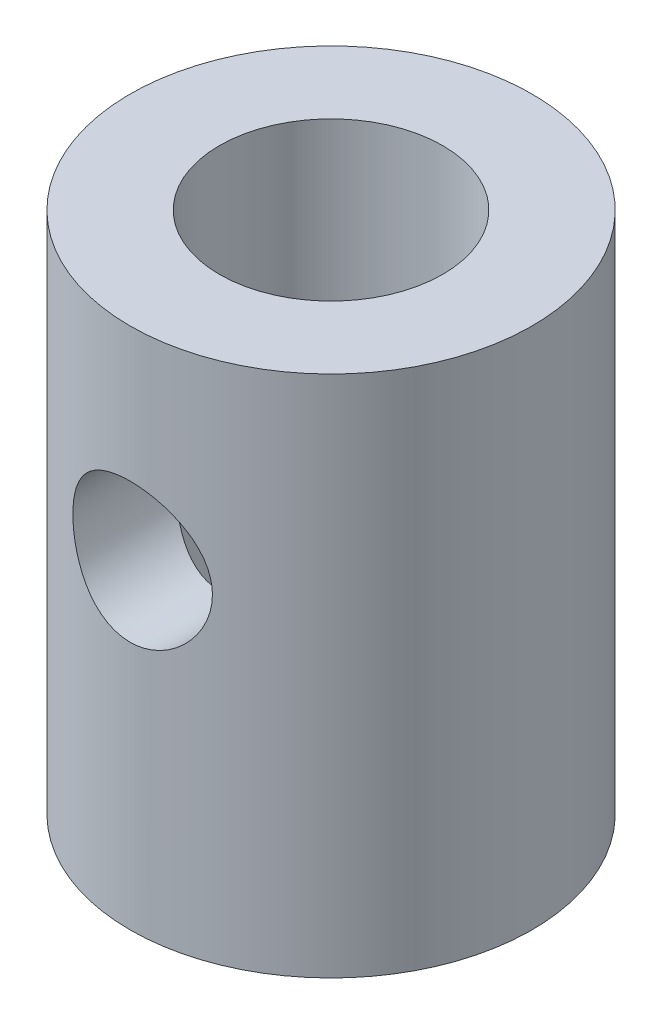
ISO-10303-21;
HEADER;
FILE_DESCRIPTION(('STEP AP214'),'2;1');
FILE_NAME('part.step','',(''),(''),'','','');
FILE_SCHEMA(('AUTOMOTIVE_DESIGN { 1 0 10303 214 1 1 1 1 }'));
ENDSEC;
DATA;
#1=APPLICATION_CONTEXT('core data for automotive mechanical design processes');
#2=APPLICATION_PROTOCOL_DEFINITION('international standard','automotive_design',2000,#1);
#3=PRODUCT_CONTEXT('',#1,'mechanical');
#4=PRODUCT('Part','Part','',(#3));
#5=PRODUCT_RELATED_PRODUCT_CATEGORY('part','',(#4));
#6=PRODUCT_DEFINITION_FORMATION('','',#4);
#7=PRODUCT_DEFINITION_CONTEXT('part definition',#1,'design');
#8=PRODUCT_DEFINITION('design','',#6,#7);
#9=PRODUCT_DEFINITION_SHAPE('','',#8);
#10=(LENGTH_UNIT() NAMED_UNIT(*) SI_UNIT(.MILLI.,.METRE.));
#11=(NAMED_UNIT(*) PLANE_ANGLE_UNIT() SI_UNIT($,.RADIAN.));
#12=(NAMED_UNIT(*) SI_UNIT($,.STERADIAN.) SOLID_ANGLE_UNIT());
#13=UNCERTAINTY_MEASURE_WITH_UNIT(LENGTH_MEASURE(1.E-05),#10,'distance_accuracy_value','');
#14=(GEOMETRIC_REPRESENTATION_CONTEXT(3) GLOBAL_UNCERTAINTY_ASSIGNED_CONTEXT((#13)) GLOBAL_UNIT_ASSIGNED_CONTEXT((#10,
#11,#12)) REPRESENTATION_CONTEXT('',''));
#15=CARTESIAN_POINT('',(0.,0.,0.));
#16=DIRECTION('',(0.,0.,1.));
#17=DIRECTION('',(1.,0.,0.));
#18=AXIS2_PLACEMENT_3D('',#15,#16,#17);
#19=CARTESIAN_POINT('',(0.,20.828,0.));
#20=DIRECTION('',(0.,1.,0.));
#21=DIRECTION('',(0.,0.,1.));
#22=AXIS2_PLACEMENT_3D('',#19,#20,#21);
#23=PLANE('',#22);
#24=CARTESIAN_POINT('',(0.,20.828,0.));
#25=DIRECTION('',(0.,1.,0.));
#26=DIRECTION('',(0.,0.,1.));
#27=AXIS2_PLACEMENT_3D('',#24,#25,#26);
#28=CIRCLE('',#27,8.001);
#29=CARTESIAN_POINT('',(0.,20.828,8.001));
#30=VERTEX_POINT('',#29);
#31=EDGE_CURVE('E12',#30,#30,#28,.T.);
#32=ORIENTED_EDGE('',*,*,#31,.T.);
#33=EDGE_LOOP('',(#32));
#34=FACE_BOUND('',#33,.T.);
#35=CARTESIAN_POINT('',(0.,20.828,0.));
#36=DIRECTION('',(0.,1.,0.));
#37=DIRECTION('',(0.,0.,1.));
#38=AXIS2_PLACEMENT_3D('',#35,#36,#37);
#39=CIRCLE('',#38,4.445);
#40=CARTESIAN_POINT('',(0.,20.828,4.445));
#41=VERTEX_POINT('',#40);
#42=EDGE_CURVE('E63',#41,#41,#39,.T.);
#43=ORIENTED_EDGE('',*,*,#42,.F.);
#44=EDGE_LOOP('',(#43));
#45=FACE_BOUND('',#44,.T.);
#46=ADVANCED_FACE('F45',(#34,#45),#23,.T.);
#47=CARTESIAN_POINT('',(0.,0.,0.));
#48=DIRECTION('',(0.,1.,0.));
#49=DIRECTION('',(0.,0.,1.));
#50=AXIS2_PLACEMENT_3D('',#47,#48,#49);
#51=PLANE('',#50);
#52=CARTESIAN_POINT('',(0.,0.,0.));
#53=DIRECTION('',(0.,1.,0.));
#54=DIRECTION('',(0.,0.,1.));
#55=AXIS2_PLACEMENT_3D('',#52,#53,#54);
#56=CIRCLE('',#55,8.001);
#57=CARTESIAN_POINT('',(0.,0.,8.001));
#58=VERTEX_POINT('',#57);
#59=EDGE_CURVE('E58',#58,#58,#56,.T.);
#60=ORIENTED_EDGE('',*,*,#59,.F.);
#61=EDGE_LOOP('',(#60));
#62=FACE_BOUND('',#61,.T.);
#63=CARTESIAN_POINT('',(0.,0.,0.));
#64=DIRECTION('',(0.,1.,0.));
#65=DIRECTION('',(0.,0.,1.));
#66=AXIS2_PLACEMENT_3D('',#63,#64,#65);
#67=CIRCLE('',#66,4.445);
#68=CARTESIAN_POINT('',(0.,0.,4.445));
#69=VERTEX_POINT('',#68);
#70=EDGE_CURVE('E65',#69,#69,#67,.T.);
#71=ORIENTED_EDGE('',*,*,#70,.T.);
#72=EDGE_LOOP('',(#71));
#73=FACE_BOUND('',#72,.T.);
#74=ADVANCED_FACE('F85',(#62,#73),#51,.F.);
#75=CARTESIAN_POINT('',(0.,20.828,0.));
#76=DIRECTION('',(0.,-1.,0.));
#77=DIRECTION('',(0.,0.,-1.));
#78=AXIS2_PLACEMENT_3D('',#75,#76,#77);
#79=CYLINDRICAL_SURFACE('',#78,8.001);
#80=CARTESIAN_POINT('',(2.77876,12.7,7.50296567114631));
#81=CARTESIAN_POINT('',(2.77876212863539,12.549059022471,7.50296389657498));
#82=CARTESIAN_POINT('',(2.76642003558003,12.3981328603388,7.5075702070208));
#83=CARTESIAN_POINT('',(2.7175626943319,12.1007778159867,7.52539149104492));
#84=CARTESIAN_POINT('',(2.6810451243575,11.9543493671349,7.53860729146559));
#85=CARTESIAN_POINT('',(2.5852951565136,11.6703510400628,7.57197390736818));
#86=CARTESIAN_POINT('',(2.52611039842604,11.5327632847795,7.59211016902121));
#87=CARTESIAN_POINT('',(2.38687097517846,11.2694217526699,7.63702697064032));
#88=CARTESIAN_POINT('',(2.30681111478616,11.1436709323454,7.66180866629354));
#89=CARTESIAN_POINT('',(2.12444775978158,10.9022261958283,7.71440543553159));
#90=CARTESIAN_POINT('',(2.0214045858259,10.7871082842002,7.74230069893931));
#91=CARTESIAN_POINT('',(1.79757523478949,10.5753898047312,7.79730666818172));
#92=CARTESIAN_POINT('',(1.67678593195421,10.4787925059835,7.82441723479302));
#93=CARTESIAN_POINT('',(1.41662934979774,10.3041923040121,7.87573557459727));
#94=CARTESIAN_POINT('',(1.27682954120934,10.2268002131398,7.89983815255547));
#95=CARTESIAN_POINT('',(0.985213131659621,10.0968633610155,7.94147388199872));
#96=CARTESIAN_POINT('',(0.833400080918614,10.0443112906793,7.95900896562897));
#97=CARTESIAN_POINT('',(0.528111330978504,9.96752098135245,7.98496560995782));
#98=CARTESIAN_POINT('',(0.374911711312878,9.94229442106042,7.9937044143121));
#99=CARTESIAN_POINT('',(0.0662212435110383,9.91772089710158,8.00221399416071));
#100=CARTESIAN_POINT('',(-0.0892689524623575,9.91836670427311,8.00198727476892));
#101=CARTESIAN_POINT('',(-0.391102956684875,9.94490922174468,7.99280210530326));
#102=CARTESIAN_POINT('',(-0.537554507985823,9.96973083051991,7.98421543014063));
#103=CARTESIAN_POINT('',(-0.824066996356055,10.0421326242364,7.95974865922028));
#104=CARTESIAN_POINT('',(-0.964127491195955,10.0897143814591,7.94386805959797));
#105=CARTESIAN_POINT('',(-1.23614284267697,10.2068707574686,7.90614198557191));
#106=CARTESIAN_POINT('',(-1.36796057926843,10.2767373750483,7.88421787265311));
#107=CARTESIAN_POINT('',(-1.61830707602438,10.4362343500376,7.83666662876341));
#108=CARTESIAN_POINT('',(-1.73683191309842,10.5258705189381,7.81103840969232));
#109=CARTESIAN_POINT('',(-1.96360692433919,10.7277048554603,7.75722388488318));
#110=CARTESIAN_POINT('',(-2.07102858533127,10.8408182700055,7.72897376698897));
#111=CARTESIAN_POINT('',(-2.26566084059581,11.0836740872239,7.67417944372543));
#112=CARTESIAN_POINT('',(-2.35286774012803,11.2134195230849,7.64763555085001));
#113=CARTESIAN_POINT('',(-2.50587740013897,11.4886867522508,7.5988919973985));
#114=CARTESIAN_POINT('',(-2.57129988370729,11.6344351226484,7.57677196712419));
#115=CARTESIAN_POINT('',(-2.67638092625534,11.9358450377868,7.5402995112186));
#116=CARTESIAN_POINT('',(-2.71605140202881,12.0915019606548,7.52594349328888));
#117=CARTESIAN_POINT('',(-2.76675213914958,12.4002282900116,7.50744836056379));
#118=CARTESIAN_POINT('',(-2.77907766052208,12.5530572869401,7.50284766415531));
#119=CARTESIAN_POINT('',(-2.77843003738575,12.8586364020602,7.5030882341987));
#120=CARTESIAN_POINT('',(-2.7654620074162,13.0113865299525,7.5079275918033));
#121=CARTESIAN_POINT('',(-2.71576306299798,13.3063461200688,7.52603991520172));
#122=CARTESIAN_POINT('',(-2.67996372211331,13.4487351067094,7.53898190993083));
#123=CARTESIAN_POINT('',(-2.58675355184134,13.7254457494719,7.57146789067085));
#124=CARTESIAN_POINT('',(-2.52933868983367,13.8597658948347,7.59101310851799));
#125=CARTESIAN_POINT('',(-2.3923339418058,14.1215499123709,7.6353175995827));
#126=CARTESIAN_POINT('',(-2.31206171669666,14.2486299680255,7.66023044157966));
#127=CARTESIAN_POINT('',(-2.13237838636147,14.4879821954156,7.71217848356268));
#128=CARTESIAN_POINT('',(-2.03296118205675,14.6002496289875,7.73921435826037));
#129=CARTESIAN_POINT('',(-1.81156710613403,14.8129401874223,7.79409302451528));
#130=CARTESIAN_POINT('',(-1.68867456398179,14.9124216432991,7.82190276357038));
#131=CARTESIAN_POINT('',(-1.42725355533765,15.0894280398298,7.87379715575659));
#132=CARTESIAN_POINT('',(-1.28872548756484,15.1669535402022,7.897881903841));
#133=CARTESIAN_POINT('',(-1.00049672840704,15.2971842122062,7.9395252909902));
#134=CARTESIAN_POINT('',(-0.850866093016549,15.3500318462177,7.95712126176772));
#135=CARTESIAN_POINT('',(-0.544102332625241,15.4295677355479,7.98395985371242));
#136=CARTESIAN_POINT('',(-0.386972201169217,15.4562663385898,7.99320577905578));
#137=CARTESIAN_POINT('',(-0.0782478360859416,15.4817534151245,8.00203216701422));
#138=CARTESIAN_POINT('',(0.0732230133873225,15.4818886738575,8.00207903022128));
#139=CARTESIAN_POINT('',(0.37392927634761,15.457613413975,7.99367224413965));
#140=CARTESIAN_POINT('',(0.523164896733083,15.4332051815959,7.98521938660355));
#141=CARTESIAN_POINT('',(0.812400419535031,15.3614496817474,7.96094866761162));
#142=CARTESIAN_POINT('',(0.952519983371858,15.3145343486015,7.94526969682297));
#143=CARTESIAN_POINT('',(1.22294079148731,15.1995050501196,7.90816445566002));
#144=CARTESIAN_POINT('',(1.35324021135037,15.1313871577091,7.88673712069251));
#145=CARTESIAN_POINT('',(1.60584523756447,14.9728528676057,7.83928723930165));
#146=CARTESIAN_POINT('',(1.72764411194743,14.8816734463466,7.81311858920086));
#147=CARTESIAN_POINT('',(1.95464569894471,14.6808702840873,7.75944528979499));
#148=CARTESIAN_POINT('',(2.05984286992704,14.5712404094713,7.73194019837719));
#149=CARTESIAN_POINT('',(2.25532594799463,14.3309573726194,7.67725647616264));
#150=CARTESIAN_POINT('',(2.34476435876245,14.19959724141,7.65014406997125));
#151=CARTESIAN_POINT('',(2.50026158652251,13.922856090322,7.60074861161155));
#152=CARTESIAN_POINT('',(2.56632395578108,13.7774772050353,7.57846482587683));
#153=CARTESIAN_POINT('',(2.67189332860254,13.4791637701792,7.54188846606034));
#154=CARTESIAN_POINT('',(2.71182633228712,13.3263964292559,7.52746837082996));
#155=CARTESIAN_POINT('',(2.7652528640181,13.0157458355809,7.5080099206605));
#156=CARTESIAN_POINT('',(2.77875777372164,12.8578648149056,7.50296752711929));
#157=CARTESIAN_POINT('',(2.77876,12.7,7.50296567114631));
#158=B_SPLINE_CURVE_WITH_KNOTS('',3,(#80,#81,#82,#83,#84,#85,#86,#87,#88,#89,#90,#91,#92,#93,
#94,#95,#96,#97,#98,#99,#100,#101,#102,#103,#104,#105,#106,#107,#108,#109,#110,#111,#112,#113,
#114,#115,#116,#117,#118,#119,#120,#121,#122,#123,#124,#125,#126,#127,#128,#129,#130,#131,#132,
#133,#134,#135,#136,#137,#138,#139,#140,#141,#142,#143,#144,#145,#146,#147,#148,#149,#150,#151,
#152,#153,#154,#155,#156,#157),.UNSPECIFIED.,.T.,.F.,(4,2,2,2,2,2,2,2,2,2,2,2,2,2,2,2,2,2,2,2,2,
2,2,2,2,2,2,2,2,2,2,2,2,2,2,2,2,2,4),(0.,0.452237275354751,0.904517989296236,1.35585331235259,
1.80730106760552,2.27618485464552,2.7451513288259,3.22753024247407,3.70976712941744,
4.17391115031731,4.63792548270855,5.08220505674032,5.52651532623993,5.97690464088239,
6.4274265296177,6.90084886477755,7.37435766129691,7.85574496923458,8.33690935512156,
8.79474649642942,9.25249106934883,9.69265905191249,10.1329091935264,10.5880016879361,
11.0432394032128,11.5225771284093,12.0019026328503,12.4784257553046,12.9547602312255,
13.4069375530072,13.8590727581817,14.3028584731562,14.7467264337541,15.2078266203897,
15.6690803977346,16.1503948229239,16.6316360752434,17.1048218274177,17.5778037501271),.UNSPECIFIED.);
#159=CARTESIAN_POINT('',(2.77876,12.7,7.50296567114631));
#160=VERTEX_POINT('',#159);
#161=EDGE_CURVE('E68',#160,#160,#158,.T.);
#162=ORIENTED_EDGE('',*,*,#161,.T.);
#163=EDGE_LOOP('',(#162));
#164=FACE_BOUND('',#163,.T.);
#165=ORIENTED_EDGE('',*,*,#31,.F.);
#166=EDGE_LOOP('',(#165));
#167=FACE_BOUND('',#166,.T.);
#168=ORIENTED_EDGE('',*,*,#59,.T.);
#169=EDGE_LOOP('',(#168));
#170=FACE_BOUND('',#169,.T.);
#171=ADVANCED_FACE('F47',(#164,#167,#170),#79,.T.);
#172=CARTESIAN_POINT('',(0.,20.828,0.));
#173=DIRECTION('',(0.,-1.,0.));
#174=DIRECTION('',(0.,0.,-1.));
#175=AXIS2_PLACEMENT_3D('',#172,#173,#174);
#176=CYLINDRICAL_SURFACE('',#175,4.445);
#177=CARTESIAN_POINT('',(2.77876,12.7,3.46936851060823));
#178=CARTESIAN_POINT('',(2.77875934731908,12.6309166395695,3.46936952642126));
#179=CARTESIAN_POINT('',(2.77617697453853,12.5618195414941,3.47144300397511));
#180=CARTESIAN_POINT('',(2.7659053558666,12.4242335926715,3.47963054206189));
#181=CARTESIAN_POINT('',(2.75821310658919,12.355745123658,3.48574697887806));
#182=CARTESIAN_POINT('',(2.72761055167755,12.1518117787755,3.50982671239287));
#183=CARTESIAN_POINT('',(2.69717492620982,12.0180823321502,3.53351938212347));
#184=CARTESIAN_POINT('',(2.61846097629787,11.7601767743478,3.59221679615339));
#185=CARTESIAN_POINT('',(2.57033733936576,11.6359287947105,3.62712314923444));
#186=CARTESIAN_POINT('',(2.45807045428438,11.3973976724189,3.70412606634024));
#187=CARTESIAN_POINT('',(2.39392675609931,11.2831148098264,3.74622283234769));
#188=CARTESIAN_POINT('',(2.24139959352143,11.0509295827165,3.83968322270754));
#189=CARTESIAN_POINT('',(2.15091818499494,10.9346003386169,3.89153226193118));
#190=CARTESIAN_POINT('',(1.95260107495747,10.7174457805415,3.99473617006767));
#191=CARTESIAN_POINT('',(1.84475041405381,10.6166339787791,4.04609057219778));
#192=CARTESIAN_POINT('',(1.59884622877513,10.4212597202322,4.14988111214226));
#193=CARTESIAN_POINT('',(1.45871837045145,10.3289207461489,4.20169947029498));
#194=CARTESIAN_POINT('',(1.23570842497045,10.209685934271,4.27049749886069));
#195=CARTESIAN_POINT('',(1.15921153282591,10.1731455252224,4.29194681468603));
#196=CARTESIAN_POINT('',(1.0024258524154,10.1069567819055,4.33124423288451));
#197=CARTESIAN_POINT('',(0.922139730078784,10.0773036865071,4.34909482188745));
#198=CARTESIAN_POINT('',(0.766716637839651,10.0279944837547,4.37901689523235));
#199=CARTESIAN_POINT('',(0.691880812151417,10.0076303741504,4.39149040785129));
#200=CARTESIAN_POINT('',(0.540299236139968,9.97316665099036,4.41270361164225));
#201=CARTESIAN_POINT('',(0.463554616015628,9.95906341941743,4.42144545914506));
#202=CARTESIAN_POINT('',(0.308845642266153,9.93735352929286,4.43493629990138));
#203=CARTESIAN_POINT('',(0.230882073796293,9.92974285114587,4.43968776360727));
#204=CARTESIAN_POINT('',(0.0744763649724609,9.92113246365793,4.44506638158912));
#205=CARTESIAN_POINT('',(-0.00396571921602898,9.92013199284313,4.44569401091701));
#206=CARTESIAN_POINT('',(-0.217798241054252,9.92648420264837,4.44171957075102));
#207=CARTESIAN_POINT('',(-0.352992315738801,9.94046218444269,4.43296889599955));
#208=CARTESIAN_POINT('',(-0.618580964045013,9.98760269902288,4.40378081027064));
#209=CARTESIAN_POINT('',(-0.748975174124842,10.0207666817899,4.38334251600323));
#210=CARTESIAN_POINT('',(-1.00218466487202,10.1048169625401,4.33247869258662));
#211=CARTESIAN_POINT('',(-1.12497976392599,10.1557482526514,4.30202781995137));
#212=CARTESIAN_POINT('',(-1.36036996342664,10.2734303570548,4.23349423478471));
#213=CARTESIAN_POINT('',(-1.47296273379573,10.340184772616,4.1954097851921));
#214=CARTESIAN_POINT('',(-1.69979849267399,10.4969349071812,4.10916041205045));
#215=CARTESIAN_POINT('',(-1.81250241254152,10.588789283837,4.06033080375533));
#216=CARTESIAN_POINT('',(-2.02188120795744,10.7883347684124,3.96024288728845));
#217=CARTESIAN_POINT('',(-2.11853233941557,10.8960488987042,3.90898112312506));
#218=CARTESIAN_POINT('',(-2.30590106258567,11.1408008852584,3.80183320626473));
#219=CARTESIAN_POINT('',(-2.39419289926148,11.2798312969247,3.746218099384));
#220=CARTESIAN_POINT('',(-2.54581877102831,11.5741298895924,3.64488361532955));
#221=CARTESIAN_POINT('',(-2.60919877489277,11.7293674875405,3.59914608244443));
#222=CARTESIAN_POINT('',(-2.69462907214621,12.0100864117547,3.53540086504373));
#223=CARTESIAN_POINT('',(-2.7231659590439,12.132650734686,3.51326347730569));
#224=CARTESIAN_POINT('',(-2.76338842587175,12.3820528994182,3.48172193450139));
#225=CARTESIAN_POINT('',(-2.77509704821515,12.5088846537962,3.47230036913979));
#226=CARTESIAN_POINT('',(-2.78095795583738,12.7635166626644,3.4676097756384));
#227=CARTESIAN_POINT('',(-2.77506990594711,12.8913184714349,3.47237326244798));
#228=CARTESIAN_POINT('',(-2.7460463181677,13.143743912564,3.49536493615487));
#229=CARTESIAN_POINT('',(-2.72289649447774,13.26836482402,3.51360427551962));
#230=CARTESIAN_POINT('',(-2.66116971519124,13.5092647128964,3.56056933951682));
#231=CARTESIAN_POINT('',(-2.62285491224707,13.6256477435633,3.58911618115727));
#232=CARTESIAN_POINT('',(-2.53225712670695,13.850610532798,3.65359877194333));
#233=CARTESIAN_POINT('',(-2.47996918777637,13.9591875051457,3.68953714185344));
#234=CARTESIAN_POINT('',(-2.35146246712366,14.1874134839656,3.77300537689092));
#235=CARTESIAN_POINT('',(-2.27258264911359,14.305233291216,3.82143933857257));
#236=CARTESIAN_POINT('',(-2.09822831575292,14.5272643553152,3.91988558451286));
#237=CARTESIAN_POINT('',(-2.00273657749874,14.6314612899018,3.96989946231299));
#238=CARTESIAN_POINT('',(-1.77976869077658,14.8402949533641,4.07529099303128));
#239=CARTESIAN_POINT('',(-1.6496189793262,14.9423192133749,4.13024151268895));
#240=CARTESIAN_POINT('',(-1.37058610451658,15.1229128175042,4.23100608346667));
#241=CARTESIAN_POINT('',(-1.22171174167533,15.2014931220705,4.27682440071036));
#242=CARTESIAN_POINT('',(-0.992006541792677,15.2968819332403,4.33355860706996));
#243=CARTESIAN_POINT('',(-0.916854710449032,15.3243746529973,4.35011408232528));
#244=CARTESIAN_POINT('',(-0.763822852165631,15.3729219683829,4.37957222074976));
#245=CARTESIAN_POINT('',(-0.685944433929623,15.3939802913079,4.39247699836062));
#246=CARTESIAN_POINT('',(-0.528171550425847,15.4292983245535,4.41422626770903));
#247=CARTESIAN_POINT('',(-0.448278910595358,15.4435639730993,4.42307430563771));
#248=CARTESIAN_POINT('',(-0.287226538729082,15.4650710920453,4.43644778809173));
#249=CARTESIAN_POINT('',(-0.206067018842617,15.4723137259525,4.44097394862309));
#250=CARTESIAN_POINT('',(0.0140011782467668,15.4821771092784,4.44713117636285));
#251=CARTESIAN_POINT('',(0.153421243012702,15.477975473228,4.44449398495324));
#252=CARTESIAN_POINT('',(0.429139182694323,15.4489270858688,4.4263979288897));
#253=CARTESIAN_POINT('',(0.565437200236037,15.4240812795984,4.41093965115307));
#254=CARTESIAN_POINT('',(0.826518097094337,15.3563007918056,4.36941235969807));
#255=CARTESIAN_POINT('',(0.951536657681684,15.3140258567242,4.34373141708127));
#256=CARTESIAN_POINT('',(1.19259166662672,15.2132289922704,4.28382986855224));
#257=CARTESIAN_POINT('',(1.3086265974615,15.1547043256029,4.24960782397509));
#258=CARTESIAN_POINT('',(1.54148165208059,15.0163638087922,4.17114803256502));
#259=CARTESIAN_POINT('',(1.65713406393677,14.9349688953849,4.12623950377363));
#260=CARTESIAN_POINT('',(1.87397153096462,14.756571840868,4.03239968061183));
#261=CARTESIAN_POINT('',(1.97514002181019,14.6595520957603,3.98346387961498));
#262=CARTESIAN_POINT('',(2.17524882281517,14.4364879455482,3.87825334712462));
#263=CARTESIAN_POINT('',(2.271763237897,14.3082755472841,3.82193809596182));
#264=CARTESIAN_POINT('',(2.44220421185394,14.0352834361282,3.71534330183155));
#265=CARTESIAN_POINT('',(2.51614321953452,13.890512914683,3.66506044173067));
#266=CARTESIAN_POINT('',(2.62507936513626,13.6202096282671,3.58753864734775));
#267=CARTESIAN_POINT('',(2.6650641124379,13.4974448461657,3.55766387756177));
#268=CARTESIAN_POINT('',(2.72775040413067,13.2455297621896,3.50984284817499));
#269=CARTESIAN_POINT('',(2.75050663171623,13.1164010611471,3.49185887050665));
#270=CARTESIAN_POINT('',(2.76891899625624,12.9384984295221,3.47723114115));
#271=CARTESIAN_POINT('',(2.77260409378571,12.8909360661006,3.47429102728759));
#272=CARTESIAN_POINT('',(2.77752513002131,12.7955846964004,3.47035911513954));
#273=CARTESIAN_POINT('',(2.77876045156025,12.7477956360493,3.46936780781339));
#274=CARTESIAN_POINT('',(2.77876,12.7,3.46936851060823));
#275=B_SPLINE_CURVE_WITH_KNOTS('',3,(#177,#178,#179,#180,#181,#182,#183,#184,#185,#186,#187,
#188,#189,#190,#191,#192,#193,#194,#195,#196,#197,#198,#199,#200,#201,#202,#203,#204,#205,#206,
#207,#208,#209,#210,#211,#212,#213,#214,#215,#216,#217,#218,#219,#220,#221,#222,#223,#224,#225,
#226,#227,#228,#229,#230,#231,#232,#233,#234,#235,#236,#237,#238,#239,#240,#241,#242,#243,#244,
#245,#246,#247,#248,#249,#250,#251,#252,#253,#254,#255,#256,#257,#258,#259,#260,#261,#262,#263,
#264,#265,#266,#267,#268,#269,#270,#271,#272,#273,#274),.UNSPECIFIED.,.T.,.F.,(4,2,2,2,2,2,2,2,
2,2,2,2,2,2,2,2,2,2,2,2,2,2,2,2,2,2,2,2,2,2,2,2,2,2,2,2,2,2,2,2,2,2,2,2,2,2,2,2,4),(0.,
0.207188847130818,0.414499579658243,0.829662558588191,1.24127798499923,1.65290497581817,
2.11978241603823,2.5870641295547,3.11075455306524,3.37275074936273,3.63456528767325,
3.86988436131692,4.10506727190766,4.34010447285821,4.57511459783444,4.9815468001551,
5.38800972258377,5.79550949302595,6.20310209770603,6.66142923986974,7.12042838187985,
7.63940693214795,8.15742328572795,8.5391487191883,8.92035096842398,9.30242768081268,
9.68482095037691,10.0608739741957,10.4370605631811,10.8848875498707,11.3331816321977,
11.8534122011215,12.373399170902,12.6182381895428,12.8629351085685,13.1074177165138,
13.3518598139607,13.7680427446574,14.1842066245911,14.5858845510242,14.9876301818846,
15.4310598272807,15.8749926114905,16.3829536515487,16.8906340775544,17.2867002533895,
17.6815039860491,17.824812430238,17.9681569732543),.UNSPECIFIED.);
#276=CARTESIAN_POINT('',(2.77876,12.7,3.46936851060823));
#277=VERTEX_POINT('',#276);
#278=EDGE_CURVE('E50',#277,#277,#275,.T.);
#279=ORIENTED_EDGE('',*,*,#278,.F.);
#280=EDGE_LOOP('',(#279));
#281=FACE_BOUND('',#280,.T.);
#282=ORIENTED_EDGE('',*,*,#42,.T.);
#283=EDGE_LOOP('',(#282));
#284=FACE_BOUND('',#283,.T.);
#285=ORIENTED_EDGE('',*,*,#70,.F.);
#286=EDGE_LOOP('',(#285));
#287=FACE_BOUND('',#286,.T.);
#288=ADVANCED_FACE('F77',(#281,#284,#287),#176,.F.);
#289=CARTESIAN_POINT('',(0.,12.7,1.651));
#290=DIRECTION('',(0.,0.,1.));
#291=DIRECTION('',(1.,0.,0.));
#292=AXIS2_PLACEMENT_3D('',#289,#290,#291);
#293=CYLINDRICAL_SURFACE('',#292,2.77876);
#294=ORIENTED_EDGE('',*,*,#278,.T.);
#295=EDGE_LOOP('',(#294));
#296=FACE_BOUND('',#295,.T.);
#297=ORIENTED_EDGE('',*,*,#161,.F.);
#298=EDGE_LOOP('',(#297));
#299=FACE_BOUND('',#298,.T.);
#300=ADVANCED_FACE('F74',(#296,#299),#293,.F.);
#301=CLOSED_SHELL('',(#46,#74,#171,#288,#300));
#302=MANIFOLD_SOLID_BREP('B2',#301);
#303=ADVANCED_BREP_SHAPE_REPRESENTATION('',(#18,#302),#14);
#304=SHAPE_DEFINITION_REPRESENTATION(#9,#303);
ENDSEC;
END-ISO-10303-21;
